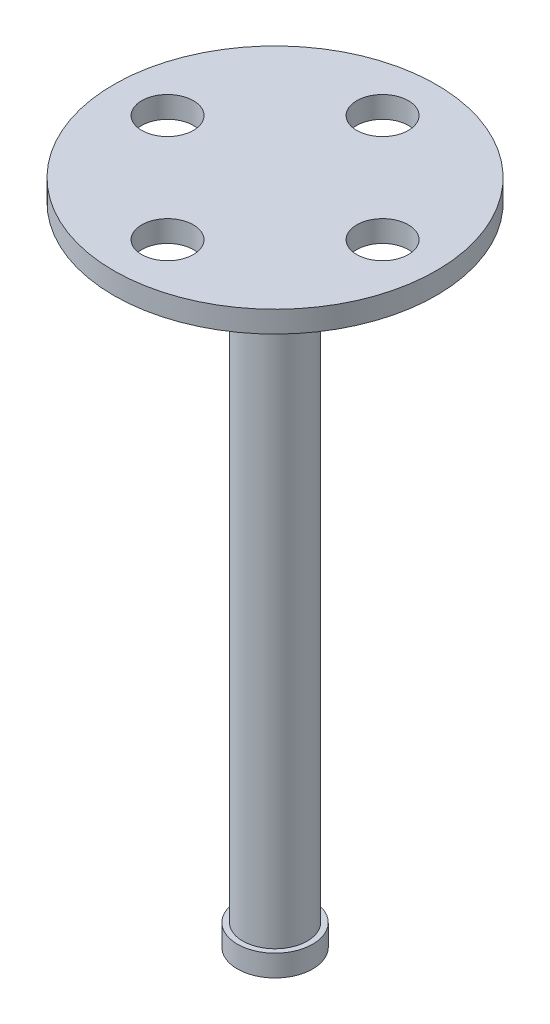
ISO-10303-21;
HEADER;
FILE_DESCRIPTION(('STEP AP214'),'2;1');
FILE_NAME('part.step','',(''),(''),'','','');
FILE_SCHEMA(('AUTOMOTIVE_DESIGN { 1 0 10303 214 1 1 1 1 }'));
ENDSEC;
DATA;
#1=APPLICATION_CONTEXT('core data for automotive mechanical design processes');
#2=APPLICATION_PROTOCOL_DEFINITION('international standard','automotive_design',2000,#1);
#3=PRODUCT_CONTEXT('',#1,'mechanical');
#4=PRODUCT('Part','Part','',(#3));
#5=PRODUCT_RELATED_PRODUCT_CATEGORY('part','',(#4));
#6=PRODUCT_DEFINITION_FORMATION('','',#4);
#7=PRODUCT_DEFINITION_CONTEXT('part definition',#1,'design');
#8=PRODUCT_DEFINITION('design','',#6,#7);
#9=PRODUCT_DEFINITION_SHAPE('','',#8);
#10=(LENGTH_UNIT() NAMED_UNIT(*) SI_UNIT(.MILLI.,.METRE.));
#11=(NAMED_UNIT(*) PLANE_ANGLE_UNIT() SI_UNIT($,.RADIAN.));
#12=(NAMED_UNIT(*) SI_UNIT($,.STERADIAN.) SOLID_ANGLE_UNIT());
#13=UNCERTAINTY_MEASURE_WITH_UNIT(LENGTH_MEASURE(1.E-05),#10,'distance_accuracy_value','');
#14=(GEOMETRIC_REPRESENTATION_CONTEXT(3) GLOBAL_UNCERTAINTY_ASSIGNED_CONTEXT((#13)) GLOBAL_UNIT_ASSIGNED_CONTEXT((#10,
#11,#12)) REPRESENTATION_CONTEXT('',''));
#15=CARTESIAN_POINT('',(0.,0.,0.));
#16=DIRECTION('',(0.,0.,1.));
#17=DIRECTION('',(1.,0.,0.));
#18=AXIS2_PLACEMENT_3D('',#15,#16,#17);
#19=CARTESIAN_POINT('',(0.,10.,0.));
#20=DIRECTION('',(0.,-1.,0.));
#21=DIRECTION('',(0.,0.,-1.));
#22=AXIS2_PLACEMENT_3D('',#19,#20,#21);
#23=CYLINDRICAL_SURFACE('',#22,17.5);
#24=CARTESIAN_POINT('',(0.,10.,0.));
#25=DIRECTION('',(0.,1.,0.));
#26=DIRECTION('',(0.,0.,1.));
#27=AXIS2_PLACEMENT_3D('',#24,#25,#26);
#28=CIRCLE('',#27,17.5);
#29=CARTESIAN_POINT('',(0.,10.,17.5));
#30=VERTEX_POINT('',#29);
#31=EDGE_CURVE('E48',#30,#30,#28,.T.);
#32=ORIENTED_EDGE('',*,*,#31,.F.);
#33=EDGE_LOOP('',(#32));
#34=FACE_BOUND('',#33,.T.);
#35=CARTESIAN_POINT('',(0.,0.,0.));
#36=DIRECTION('',(0.,1.,0.));
#37=DIRECTION('',(0.,0.,1.));
#38=AXIS2_PLACEMENT_3D('',#35,#36,#37);
#39=CIRCLE('',#38,17.5);
#40=CARTESIAN_POINT('',(0.,0.,17.5));
#41=VERTEX_POINT('',#40);
#42=EDGE_CURVE('E52',#41,#41,#39,.T.);
#43=ORIENTED_EDGE('',*,*,#42,.T.);
#44=EDGE_LOOP('',(#43));
#45=FACE_BOUND('',#44,.T.);
#46=ADVANCED_FACE('F37',(#34,#45),#23,.T.);
#47=CARTESIAN_POINT('',(0.,10.,0.));
#48=DIRECTION('',(0.,1.,0.));
#49=DIRECTION('',(0.,0.,1.));
#50=AXIS2_PLACEMENT_3D('',#47,#48,#49);
#51=PLANE('',#50);
#52=CARTESIAN_POINT('',(0.,10.,0.));
#53=DIRECTION('',(0.,1.,0.));
#54=DIRECTION('',(0.,0.,1.));
#55=AXIS2_PLACEMENT_3D('',#52,#53,#54);
#56=CIRCLE('',#55,15.);
#57=CARTESIAN_POINT('',(0.,10.,15.));
#58=VERTEX_POINT('',#57);
#59=EDGE_CURVE('E56',#58,#58,#56,.F.);
#60=ORIENTED_EDGE('',*,*,#59,.T.);
#61=EDGE_LOOP('',(#60));
#62=FACE_BOUND('',#61,.T.);
#63=ORIENTED_EDGE('',*,*,#31,.T.);
#64=EDGE_LOOP('',(#63));
#65=FACE_BOUND('',#64,.T.);
#66=ADVANCED_FACE('F124',(#62,#65),#51,.T.);
#67=CARTESIAN_POINT('',(0.,0.,0.));
#68=DIRECTION('',(0.,1.,0.));
#69=DIRECTION('',(0.,0.,1.));
#70=AXIS2_PLACEMENT_3D('',#67,#68,#69);
#71=PLANE('',#70);
#72=ORIENTED_EDGE('',*,*,#42,.F.);
#73=EDGE_LOOP('',(#72));
#74=FACE_BOUND('',#73,.T.);
#75=ADVANCED_FACE('F129',(#74),#71,.F.);
#76=CARTESIAN_POINT('',(0.,300.,0.));
#77=DIRECTION('',(0.,-1.,0.));
#78=DIRECTION('',(0.,0.,-1.));
#79=AXIS2_PLACEMENT_3D('',#76,#77,#78);
#80=CYLINDRICAL_SURFACE('',#79,15.);
#81=CARTESIAN_POINT('',(0.,290.,0.));
#82=DIRECTION('',(0.,1.,0.));
#83=DIRECTION('',(0.,0.,1.));
#84=AXIS2_PLACEMENT_3D('',#81,#82,#83);
#85=CIRCLE('',#84,15.);
#86=CARTESIAN_POINT('',(0.,290.,15.));
#87=VERTEX_POINT('',#86);
#88=EDGE_CURVE('E10',#87,#87,#85,.F.);
#89=ORIENTED_EDGE('',*,*,#88,.T.);
#90=EDGE_LOOP('',(#89));
#91=FACE_BOUND('',#90,.T.);
#92=ORIENTED_EDGE('',*,*,#59,.F.);
#93=EDGE_LOOP('',(#92));
#94=FACE_BOUND('',#93,.T.);
#95=ADVANCED_FACE('F109',(#91,#94),#80,.T.);
#96=CARTESIAN_POINT('',(0.,310.,0.));
#97=DIRECTION('',(0.,-1.,0.));
#98=DIRECTION('',(0.,0.,-1.));
#99=AXIS2_PLACEMENT_3D('',#96,#97,#98);
#100=CYLINDRICAL_SURFACE('',#99,75.);
#101=CARTESIAN_POINT('',(0.,310.,0.));
#102=DIRECTION('',(0.,1.,0.));
#103=DIRECTION('',(0.,0.,1.));
#104=AXIS2_PLACEMENT_3D('',#101,#102,#103);
#105=CIRCLE('',#104,75.);
#106=CARTESIAN_POINT('',(0.,310.,75.));
#107=VERTEX_POINT('',#106);
#108=EDGE_CURVE('E60',#107,#107,#105,.T.);
#109=ORIENTED_EDGE('',*,*,#108,.F.);
#110=EDGE_LOOP('',(#109));
#111=FACE_BOUND('',#110,.T.);
#112=CARTESIAN_POINT('',(0.,300.,0.));
#113=DIRECTION('',(0.,1.,0.));
#114=DIRECTION('',(0.,0.,1.));
#115=AXIS2_PLACEMENT_3D('',#112,#113,#114);
#116=CIRCLE('',#115,75.);
#117=CARTESIAN_POINT('',(0.,300.,75.));
#118=VERTEX_POINT('',#117);
#119=EDGE_CURVE('E61',#118,#118,#116,.T.);
#120=ORIENTED_EDGE('',*,*,#119,.T.);
#121=EDGE_LOOP('',(#120));
#122=FACE_BOUND('',#121,.T.);
#123=ADVANCED_FACE('F97',(#111,#122),#100,.T.);
#124=CARTESIAN_POINT('',(0.,310.,0.));
#125=DIRECTION('',(0.,1.,0.));
#126=DIRECTION('',(0.,0.,1.));
#127=AXIS2_PLACEMENT_3D('',#124,#125,#126);
#128=PLANE('',#127);
#129=CARTESIAN_POINT('',(50.,310.,0.));
#130=DIRECTION('',(0.,1.,0.));
#131=DIRECTION('',(0.,0.,1.));
#132=AXIS2_PLACEMENT_3D('',#129,#130,#131);
#133=CIRCLE('',#132,12.);
#134=CARTESIAN_POINT('',(50.,310.,12.));
#135=VERTEX_POINT('',#134);
#136=EDGE_CURVE('E87',#135,#135,#133,.T.);
#137=ORIENTED_EDGE('',*,*,#136,.F.);
#138=EDGE_LOOP('',(#137));
#139=FACE_BOUND('',#138,.T.);
#140=CARTESIAN_POINT('',(0.,310.,50.));
#141=DIRECTION('',(0.,1.,0.));
#142=DIRECTION('',(0.,0.,1.));
#143=AXIS2_PLACEMENT_3D('',#140,#141,#142);
#144=CIRCLE('',#143,12.);
#145=CARTESIAN_POINT('',(0.,310.,62.));
#146=VERTEX_POINT('',#145);
#147=EDGE_CURVE('E81',#146,#146,#144,.T.);
#148=ORIENTED_EDGE('',*,*,#147,.F.);
#149=EDGE_LOOP('',(#148));
#150=FACE_BOUND('',#149,.T.);
#151=CARTESIAN_POINT('',(-50.,310.,0.));
#152=DIRECTION('',(0.,1.,0.));
#153=DIRECTION('',(0.,0.,1.));
#154=AXIS2_PLACEMENT_3D('',#151,#152,#153);
#155=CIRCLE('',#154,12.);
#156=CARTESIAN_POINT('',(-50.,310.,12.));
#157=VERTEX_POINT('',#156);
#158=EDGE_CURVE('E75',#157,#157,#155,.T.);
#159=ORIENTED_EDGE('',*,*,#158,.F.);
#160=EDGE_LOOP('',(#159));
#161=FACE_BOUND('',#160,.T.);
#162=CARTESIAN_POINT('',(0.,310.,-50.));
#163=DIRECTION('',(0.,1.,0.));
#164=DIRECTION('',(0.,0.,1.));
#165=AXIS2_PLACEMENT_3D('',#162,#163,#164);
#166=CIRCLE('',#165,12.);
#167=CARTESIAN_POINT('',(0.,310.,-38.));
#168=VERTEX_POINT('',#167);
#169=EDGE_CURVE('E69',#168,#168,#166,.T.);
#170=ORIENTED_EDGE('',*,*,#169,.F.);
#171=EDGE_LOOP('',(#170));
#172=FACE_BOUND('',#171,.T.);
#173=ORIENTED_EDGE('',*,*,#108,.T.);
#174=EDGE_LOOP('',(#173));
#175=FACE_BOUND('',#174,.T.);
#176=ADVANCED_FACE('F93',(#139,#150,#161,#172,#175),#128,.T.);
#177=CARTESIAN_POINT('',(0.,300.,0.));
#178=DIRECTION('',(0.,1.,0.));
#179=DIRECTION('',(0.,0.,1.));
#180=AXIS2_PLACEMENT_3D('',#177,#178,#179);
#181=PLANE('',#180);
#182=CARTESIAN_POINT('',(50.,300.,0.));
#183=DIRECTION('',(0.,1.,0.));
#184=DIRECTION('',(0.,0.,1.));
#185=AXIS2_PLACEMENT_3D('',#182,#183,#184);
#186=CIRCLE('',#185,12.);
#187=CARTESIAN_POINT('',(50.,300.,12.));
#188=VERTEX_POINT('',#187);
#189=EDGE_CURVE('E84',#188,#188,#186,.T.);
#190=ORIENTED_EDGE('',*,*,#189,.T.);
#191=EDGE_LOOP('',(#190));
#192=FACE_BOUND('',#191,.T.);
#193=CARTESIAN_POINT('',(0.,300.,50.));
#194=DIRECTION('',(0.,1.,0.));
#195=DIRECTION('',(0.,0.,1.));
#196=AXIS2_PLACEMENT_3D('',#193,#194,#195);
#197=CIRCLE('',#196,12.);
#198=CARTESIAN_POINT('',(0.,300.,62.));
#199=VERTEX_POINT('',#198);
#200=EDGE_CURVE('E78',#199,#199,#197,.T.);
#201=ORIENTED_EDGE('',*,*,#200,.T.);
#202=EDGE_LOOP('',(#201));
#203=FACE_BOUND('',#202,.T.);
#204=CARTESIAN_POINT('',(-50.,300.,0.));
#205=DIRECTION('',(0.,1.,0.));
#206=DIRECTION('',(0.,0.,1.));
#207=AXIS2_PLACEMENT_3D('',#204,#205,#206);
#208=CIRCLE('',#207,12.);
#209=CARTESIAN_POINT('',(-50.,300.,12.));
#210=VERTEX_POINT('',#209);
#211=EDGE_CURVE('E72',#210,#210,#208,.T.);
#212=ORIENTED_EDGE('',*,*,#211,.T.);
#213=EDGE_LOOP('',(#212));
#214=FACE_BOUND('',#213,.T.);
#215=CARTESIAN_POINT('',(0.,300.,-50.));
#216=DIRECTION('',(0.,1.,0.));
#217=DIRECTION('',(0.,0.,1.));
#218=AXIS2_PLACEMENT_3D('',#215,#216,#217);
#219=CIRCLE('',#218,12.);
#220=CARTESIAN_POINT('',(0.,300.,-38.));
#221=VERTEX_POINT('',#220);
#222=EDGE_CURVE('E64',#221,#221,#219,.T.);
#223=ORIENTED_EDGE('',*,*,#222,.T.);
#224=EDGE_LOOP('',(#223));
#225=FACE_BOUND('',#224,.T.);
#226=CARTESIAN_POINT('',(0.,300.,0.));
#227=DIRECTION('',(0.,1.,0.));
#228=DIRECTION('',(0.,0.,1.));
#229=AXIS2_PLACEMENT_3D('',#226,#227,#228);
#230=CIRCLE('',#229,25.);
#231=CARTESIAN_POINT('',(0.,300.,25.));
#232=VERTEX_POINT('',#231);
#233=EDGE_CURVE('E44',#232,#232,#230,.T.);
#234=ORIENTED_EDGE('',*,*,#233,.T.);
#235=EDGE_LOOP('',(#234));
#236=FACE_BOUND('',#235,.T.);
#237=ORIENTED_EDGE('',*,*,#119,.F.);
#238=EDGE_LOOP('',(#237));
#239=FACE_BOUND('',#238,.T.);
#240=ADVANCED_FACE('F96',(#192,#203,#214,#225,#236,#239),#181,.F.);
#241=CARTESIAN_POINT('',(0.,290.,0.));
#242=DIRECTION('',(0.,1.,0.));
#243=DIRECTION('',(0.,0.,1.));
#244=AXIS2_PLACEMENT_3D('',#241,#242,#243);
#245=TOROIDAL_SURFACE('',#244,25.,10.);
#246=ORIENTED_EDGE('',*,*,#88,.F.);
#247=EDGE_LOOP('',(#246));
#248=FACE_BOUND('',#247,.T.);
#249=ORIENTED_EDGE('',*,*,#233,.F.);
#250=EDGE_LOOP('',(#249));
#251=FACE_BOUND('',#250,.T.);
#252=ADVANCED_FACE('F39',(#248,#251),#245,.F.);
#253=CARTESIAN_POINT('',(0.,310.,-50.));
#254=DIRECTION('',(0.,1.,0.));
#255=DIRECTION('',(0.,0.,1.));
#256=AXIS2_PLACEMENT_3D('',#253,#254,#255);
#257=CYLINDRICAL_SURFACE('',#256,12.);
#258=ORIENTED_EDGE('',*,*,#222,.F.);
#259=EDGE_LOOP('',(#258));
#260=FACE_BOUND('',#259,.T.);
#261=ORIENTED_EDGE('',*,*,#169,.T.);
#262=EDGE_LOOP('',(#261));
#263=FACE_BOUND('',#262,.T.);
#264=ADVANCED_FACE('F120',(#260,#263),#257,.F.);
#265=CARTESIAN_POINT('',(-50.,310.,0.));
#266=DIRECTION('',(0.,1.,0.));
#267=DIRECTION('',(0.,0.,1.));
#268=AXIS2_PLACEMENT_3D('',#265,#266,#267);
#269=CYLINDRICAL_SURFACE('',#268,12.);
#270=ORIENTED_EDGE('',*,*,#211,.F.);
#271=EDGE_LOOP('',(#270));
#272=FACE_BOUND('',#271,.T.);
#273=ORIENTED_EDGE('',*,*,#158,.T.);
#274=EDGE_LOOP('',(#273));
#275=FACE_BOUND('',#274,.T.);
#276=ADVANCED_FACE('F173',(#272,#275),#269,.F.);
#277=CARTESIAN_POINT('',(0.,310.,50.));
#278=DIRECTION('',(0.,1.,0.));
#279=DIRECTION('',(0.,0.,1.));
#280=AXIS2_PLACEMENT_3D('',#277,#278,#279);
#281=CYLINDRICAL_SURFACE('',#280,12.);
#282=ORIENTED_EDGE('',*,*,#200,.F.);
#283=EDGE_LOOP('',(#282));
#284=FACE_BOUND('',#283,.T.);
#285=ORIENTED_EDGE('',*,*,#147,.T.);
#286=EDGE_LOOP('',(#285));
#287=FACE_BOUND('',#286,.T.);
#288=ADVANCED_FACE('F182',(#284,#287),#281,.F.);
#289=CARTESIAN_POINT('',(50.,310.,0.));
#290=DIRECTION('',(0.,1.,0.));
#291=DIRECTION('',(0.,0.,1.));
#292=AXIS2_PLACEMENT_3D('',#289,#290,#291);
#293=CYLINDRICAL_SURFACE('',#292,12.);
#294=ORIENTED_EDGE('',*,*,#189,.F.);
#295=EDGE_LOOP('',(#294));
#296=FACE_BOUND('',#295,.T.);
#297=ORIENTED_EDGE('',*,*,#136,.T.);
#298=EDGE_LOOP('',(#297));
#299=FACE_BOUND('',#298,.T.);
#300=ADVANCED_FACE('F91',(#296,#299),#293,.F.);
#301=CLOSED_SHELL('',(#46,#66,#75,#95,#123,#176,#240,#252,#264,#276,#288,#300));
#302=MANIFOLD_SOLID_BREP('B2',#301);
#303=ADVANCED_BREP_SHAPE_REPRESENTATION('',(#18,#302),#14);
#304=SHAPE_DEFINITION_REPRESENTATION(#9,#303);
ENDSEC;
END-ISO-10303-21;
